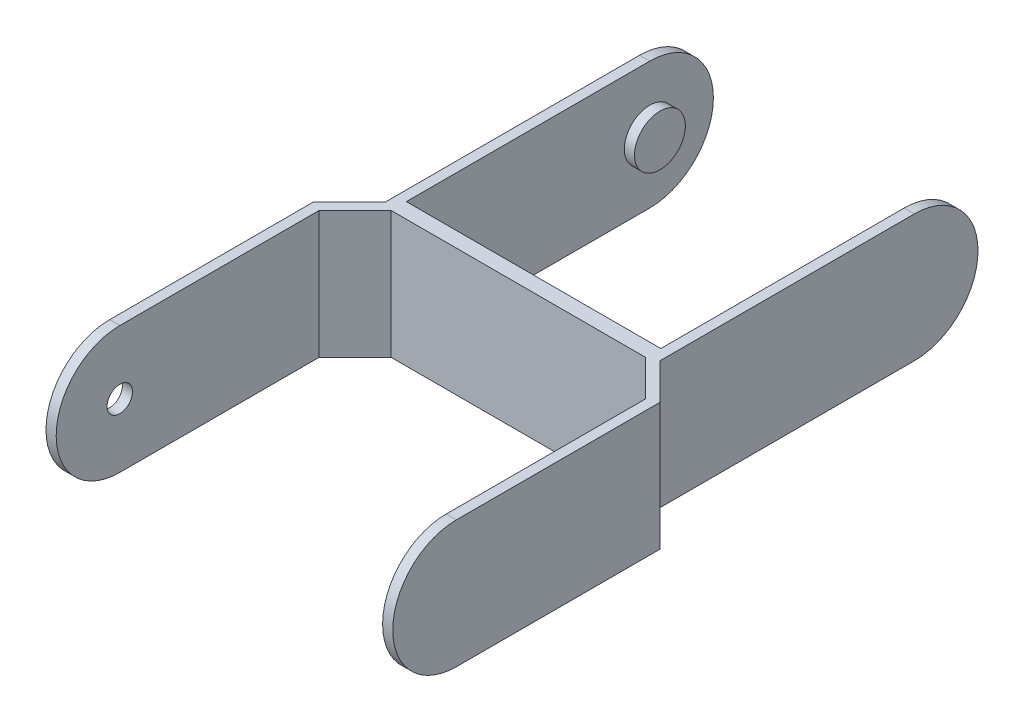
ISO-10303-21;
HEADER;
FILE_DESCRIPTION(('STEP AP214'),'2;1');
FILE_NAME('part.step','',(''),(''),'','','');
FILE_SCHEMA(('AUTOMOTIVE_DESIGN { 1 0 10303 214 1 1 1 1 }'));
ENDSEC;
DATA;
#1=APPLICATION_CONTEXT('core data for automotive mechanical design processes');
#2=APPLICATION_PROTOCOL_DEFINITION('international standard','automotive_design',2000,#1);
#3=PRODUCT_CONTEXT('',#1,'mechanical');
#4=PRODUCT('Part','Part','',(#3));
#5=PRODUCT_RELATED_PRODUCT_CATEGORY('part','',(#4));
#6=PRODUCT_DEFINITION_FORMATION('','',#4);
#7=PRODUCT_DEFINITION_CONTEXT('part definition',#1,'design');
#8=PRODUCT_DEFINITION('design','',#6,#7);
#9=PRODUCT_DEFINITION_SHAPE('','',#8);
#10=(LENGTH_UNIT() NAMED_UNIT(*) SI_UNIT(.MILLI.,.METRE.));
#11=(NAMED_UNIT(*) PLANE_ANGLE_UNIT() SI_UNIT($,.RADIAN.));
#12=(NAMED_UNIT(*) SI_UNIT($,.STERADIAN.) SOLID_ANGLE_UNIT());
#13=UNCERTAINTY_MEASURE_WITH_UNIT(LENGTH_MEASURE(1.E-05),#10,'distance_accuracy_value','');
#14=(GEOMETRIC_REPRESENTATION_CONTEXT(3) GLOBAL_UNCERTAINTY_ASSIGNED_CONTEXT((#13)) GLOBAL_UNIT_ASSIGNED_CONTEXT((#10,
#11,#12)) REPRESENTATION_CONTEXT('',''));
#15=CARTESIAN_POINT('',(0.,0.,0.));
#16=DIRECTION('',(0.,0.,1.));
#17=DIRECTION('',(1.,0.,0.));
#18=AXIS2_PLACEMENT_3D('',#15,#16,#17);
#19=CARTESIAN_POINT('',(-25.,25.,-37.9682734870824));
#20=DIRECTION('',(1.,0.,0.));
#21=DIRECTION('',(0.,0.,-1.));
#22=AXIS2_PLACEMENT_3D('',#19,#20,#21);
#23=PLANE('',#22);
#24=CARTESIAN_POINT('',(-25.,12.5,-37.9682734870824));
#25=DIRECTION('',(1.,0.,0.));
#26=DIRECTION('',(0.,0.,-1.));
#27=AXIS2_PLACEMENT_3D('',#24,#25,#26);
#28=CIRCLE('',#27,5.);
#29=CARTESIAN_POINT('',(-25.,12.5,-42.9682734870824));
#30=VERTEX_POINT('',#29);
#31=EDGE_CURVE('E282',#30,#30,#28,.T.);
#32=ORIENTED_EDGE('',*,*,#31,.F.);
#33=EDGE_LOOP('',(#32));
#34=FACE_BOUND('',#33,.T.);
#35=DIRECTION('',(0.,0.,1.));
#36=VECTOR('',#35,1.);
#37=CARTESIAN_POINT('',(-25.,0.,-37.9682734870824));
#38=LINE('',#37,#36);
#39=CARTESIAN_POINT('',(-25.,0.,-37.9682734870824));
#40=VERTEX_POINT('',#39);
#41=CARTESIAN_POINT('',(-25.,0.,9.86015363766381));
#42=VERTEX_POINT('',#41);
#43=EDGE_CURVE('E204',#40,#42,#38,.T.);
#44=ORIENTED_EDGE('',*,*,#43,.F.);
#45=CARTESIAN_POINT('',(-25.,12.5,-37.9682734870824));
#46=DIRECTION('',(-1.,0.,0.));
#47=DIRECTION('',(0.,0.,1.));
#48=AXIS2_PLACEMENT_3D('',#45,#46,#47);
#49=CIRCLE('',#48,12.5);
#50=CARTESIAN_POINT('',(-25.,25.,-37.9682734870824));
#51=VERTEX_POINT('',#50);
#52=EDGE_CURVE('E117',#51,#40,#49,.T.);
#53=ORIENTED_EDGE('',*,*,#52,.F.);
#54=DIRECTION('',(0.,0.,1.));
#55=VECTOR('',#54,1.);
#56=CARTESIAN_POINT('',(-25.,25.,-37.9682734870824));
#57=LINE('',#56,#55);
#58=CARTESIAN_POINT('',(-25.,25.,9.86015363766381));
#59=VERTEX_POINT('',#58);
#60=EDGE_CURVE('E250',#51,#59,#57,.T.);
#61=ORIENTED_EDGE('',*,*,#60,.T.);
#62=DIRECTION('',(0.,-1.,0.));
#63=VECTOR('',#62,1.);
#64=CARTESIAN_POINT('',(-25.,25.,9.86015363766381));
#65=LINE('',#64,#63);
#66=EDGE_CURVE('E125',#59,#42,#65,.T.);
#67=ORIENTED_EDGE('',*,*,#66,.T.);
#68=EDGE_LOOP('',(#44,#53,#61,#67));
#69=FACE_BOUND('',#68,.T.);
#70=ADVANCED_FACE('F47',(#34,#69),#23,.T.);
#71=CARTESIAN_POINT('',(-27.,25.,12.0317265129176));
#72=DIRECTION('',(-1.,0.,0.));
#73=DIRECTION('',(0.,0.,1.));
#74=AXIS2_PLACEMENT_3D('',#71,#72,#73);
#75=PLANE('',#74);
#76=DIRECTION('',(0.,0.,-1.));
#77=VECTOR('',#76,1.);
#78=CARTESIAN_POINT('',(-27.,0.,12.0317265129176));
#79=LINE('',#78,#77);
#80=CARTESIAN_POINT('',(-27.,0.,12.0317265129176));
#81=VERTEX_POINT('',#80);
#82=CARTESIAN_POINT('',(-27.,0.,-37.9682734870824));
#83=VERTEX_POINT('',#82);
#84=EDGE_CURVE('E244',#81,#83,#79,.T.);
#85=ORIENTED_EDGE('',*,*,#84,.F.);
#86=DIRECTION('',(0.,-1.,0.));
#87=VECTOR('',#86,1.);
#88=CARTESIAN_POINT('',(-27.,25.,12.0317265129176));
#89=LINE('',#88,#87);
#90=CARTESIAN_POINT('',(-27.,25.,12.0317265129176));
#91=VERTEX_POINT('',#90);
#92=EDGE_CURVE('E64',#91,#81,#89,.T.);
#93=ORIENTED_EDGE('',*,*,#92,.F.);
#94=DIRECTION('',(0.,0.,-1.));
#95=VECTOR('',#94,1.);
#96=CARTESIAN_POINT('',(-27.,25.,12.0317265129176));
#97=LINE('',#96,#95);
#98=CARTESIAN_POINT('',(-27.,25.,-37.9682734870824));
#99=VERTEX_POINT('',#98);
#100=EDGE_CURVE('E200',#91,#99,#97,.T.);
#101=ORIENTED_EDGE('',*,*,#100,.T.);
#102=CARTESIAN_POINT('',(-27.,12.5,-37.9682734870824));
#103=DIRECTION('',(-1.,0.,0.));
#104=DIRECTION('',(0.,0.,1.));
#105=AXIS2_PLACEMENT_3D('',#102,#103,#104);
#106=CIRCLE('',#105,12.5);
#107=EDGE_CURVE('E270',#99,#83,#106,.T.);
#108=ORIENTED_EDGE('',*,*,#107,.T.);
#109=EDGE_LOOP('',(#85,#93,#101,#108));
#110=FACE_BOUND('',#109,.T.);
#111=ADVANCED_FACE('F396',(#110),#75,.T.);
#112=CARTESIAN_POINT('',(-34.0710678118655,25.,19.1027943247831));
#113=DIRECTION('',(-0.707106781186547,0.,-0.707106781186548));
#114=DIRECTION('',(-0.707106781186548,0.,0.707106781186547));
#115=AXIS2_PLACEMENT_3D('',#112,#113,#114);
#116=PLANE('',#115);
#117=DIRECTION('',(0.707106781186548,0.,-0.707106781186547));
#118=VECTOR('',#117,1.);
#119=CARTESIAN_POINT('',(-34.0710678118655,0.,19.1027943247831));
#120=LINE('',#119,#118);
#121=CARTESIAN_POINT('',(-34.0710678118655,0.,19.1027943247831));
#122=VERTEX_POINT('',#121);
#123=EDGE_CURVE('E241',#122,#81,#120,.T.);
#124=ORIENTED_EDGE('',*,*,#123,.F.);
#125=DIRECTION('',(0.,-1.,0.));
#126=VECTOR('',#125,1.);
#127=CARTESIAN_POINT('',(-34.0710678118655,25.,19.1027943247831));
#128=LINE('',#127,#126);
#129=CARTESIAN_POINT('',(-34.0710678118655,25.,19.1027943247831));
#130=VERTEX_POINT('',#129);
#131=EDGE_CURVE('E174',#130,#122,#128,.T.);
#132=ORIENTED_EDGE('',*,*,#131,.F.);
#133=DIRECTION('',(0.707106781186548,0.,-0.707106781186547));
#134=VECTOR('',#133,1.);
#135=CARTESIAN_POINT('',(-34.0710678118655,25.,19.1027943247831));
#136=LINE('',#135,#134);
#137=EDGE_CURVE('E198',#130,#91,#136,.T.);
#138=ORIENTED_EDGE('',*,*,#137,.T.);
#139=ORIENTED_EDGE('',*,*,#92,.T.);
#140=EDGE_LOOP('',(#124,#132,#138,#139));
#141=FACE_BOUND('',#140,.T.);
#142=ADVANCED_FACE('F403',(#141),#116,.T.);
#143=CARTESIAN_POINT('',(-34.0710678118655,25.,59.1027943247831));
#144=DIRECTION('',(-1.,0.,0.));
#145=DIRECTION('',(0.,0.,1.));
#146=AXIS2_PLACEMENT_3D('',#143,#144,#145);
#147=PLANE('',#146);
#148=CARTESIAN_POINT('',(-34.0710678118655,12.5,59.1027943247831));
#149=DIRECTION('',(-1.,0.,0.));
#150=DIRECTION('',(0.,0.,1.));
#151=AXIS2_PLACEMENT_3D('',#148,#149,#150);
#152=CIRCLE('',#151,2.5);
#153=CARTESIAN_POINT('',(-34.0710678118655,12.5,61.6027943247831));
#154=VERTEX_POINT('',#153);
#155=EDGE_CURVE('E271',#154,#154,#152,.T.);
#156=ORIENTED_EDGE('',*,*,#155,.F.);
#157=EDGE_LOOP('',(#156));
#158=FACE_BOUND('',#157,.T.);
#159=DIRECTION('',(0.,0.,-1.));
#160=VECTOR('',#159,1.);
#161=CARTESIAN_POINT('',(-34.0710678118655,0.,59.1027943247831));
#162=LINE('',#161,#160);
#163=CARTESIAN_POINT('',(-34.0710678118655,0.,59.1027943247831));
#164=VERTEX_POINT('',#163);
#165=EDGE_CURVE('E238',#164,#122,#162,.T.);
#166=ORIENTED_EDGE('',*,*,#165,.F.);
#167=CARTESIAN_POINT('',(-34.0710678118655,12.5,59.1027943247831));
#168=DIRECTION('',(-1.,0.,0.));
#169=DIRECTION('',(0.,0.,1.));
#170=AXIS2_PLACEMENT_3D('',#167,#168,#169);
#171=CIRCLE('',#170,12.5);
#172=CARTESIAN_POINT('',(-34.0710678118655,25.,59.1027943247831));
#173=VERTEX_POINT('',#172);
#174=EDGE_CURVE('E286',#164,#173,#171,.T.);
#175=ORIENTED_EDGE('',*,*,#174,.T.);
#176=DIRECTION('',(0.,0.,-1.));
#177=VECTOR('',#176,1.);
#178=CARTESIAN_POINT('',(-34.0710678118655,25.,59.1027943247831));
#179=LINE('',#178,#177);
#180=EDGE_CURVE('E195',#173,#130,#179,.T.);
#181=ORIENTED_EDGE('',*,*,#180,.T.);
#182=ORIENTED_EDGE('',*,*,#131,.T.);
#183=EDGE_LOOP('',(#166,#175,#181,#182));
#184=FACE_BOUND('',#183,.T.);
#185=ADVANCED_FACE('F462',(#158,#184),#147,.T.);
#186=CARTESIAN_POINT('',(-32.0710678118655,25.,19.9312214495293));
#187=DIRECTION('',(1.,0.,0.));
#188=DIRECTION('',(0.,0.,-1.));
#189=AXIS2_PLACEMENT_3D('',#186,#187,#188);
#190=PLANE('',#189);
#191=CARTESIAN_POINT('',(-32.0710678118655,12.5,59.1027943247831));
#192=DIRECTION('',(1.,0.,0.));
#193=DIRECTION('',(0.,0.,-1.));
#194=AXIS2_PLACEMENT_3D('',#191,#192,#193);
#195=CIRCLE('',#194,2.5);
#196=CARTESIAN_POINT('',(-32.0710678118655,12.5,56.6027943247831));
#197=VERTEX_POINT('',#196);
#198=EDGE_CURVE('E268',#197,#197,#195,.T.);
#199=ORIENTED_EDGE('',*,*,#198,.F.);
#200=EDGE_LOOP('',(#199));
#201=FACE_BOUND('',#200,.T.);
#202=DIRECTION('',(0.,0.,1.));
#203=VECTOR('',#202,1.);
#204=CARTESIAN_POINT('',(-32.0710678118655,0.,19.9312214495293));
#205=LINE('',#204,#203);
#206=CARTESIAN_POINT('',(-32.0710678118655,0.,19.9312214495293));
#207=VERTEX_POINT('',#206);
#208=CARTESIAN_POINT('',(-32.0710678118655,0.,59.1027943247831));
#209=VERTEX_POINT('',#208);
#210=EDGE_CURVE('E169',#207,#209,#205,.T.);
#211=ORIENTED_EDGE('',*,*,#210,.F.);
#212=DIRECTION('',(0.,-1.,0.));
#213=VECTOR('',#212,1.);
#214=CARTESIAN_POINT('',(-32.0710678118655,25.,19.9312214495293));
#215=LINE('',#214,#213);
#216=CARTESIAN_POINT('',(-32.0710678118655,25.,19.9312214495293));
#217=VERTEX_POINT('',#216);
#218=EDGE_CURVE('E162',#217,#207,#215,.T.);
#219=ORIENTED_EDGE('',*,*,#218,.F.);
#220=DIRECTION('',(0.,0.,1.));
#221=VECTOR('',#220,1.);
#222=CARTESIAN_POINT('',(-32.0710678118655,25.,19.9312214495293));
#223=LINE('',#222,#221);
#224=CARTESIAN_POINT('',(-32.0710678118655,25.,59.1027943247831));
#225=VERTEX_POINT('',#224);
#226=EDGE_CURVE('E167',#217,#225,#223,.T.);
#227=ORIENTED_EDGE('',*,*,#226,.T.);
#228=CARTESIAN_POINT('',(-32.0710678118655,12.5,59.1027943247831));
#229=DIRECTION('',(-1.,0.,0.));
#230=DIRECTION('',(0.,0.,1.));
#231=AXIS2_PLACEMENT_3D('',#228,#229,#230);
#232=CIRCLE('',#231,12.5);
#233=EDGE_CURVE('E288',#209,#225,#232,.T.);
#234=ORIENTED_EDGE('',*,*,#233,.F.);
#235=EDGE_LOOP('',(#211,#219,#227,#234));
#236=FACE_BOUND('',#235,.T.);
#237=ADVANCED_FACE('F164',(#201,#236),#190,.T.);
#238=CARTESIAN_POINT('',(-25.,25.,12.8601536376638));
#239=DIRECTION('',(0.707106781186547,0.,0.707106781186548));
#240=DIRECTION('',(0.707106781186548,0.,-0.707106781186547));
#241=AXIS2_PLACEMENT_3D('',#238,#239,#240);
#242=PLANE('',#241);
#243=DIRECTION('',(-0.707106781186548,0.,0.707106781186547));
#244=VECTOR('',#243,1.);
#245=CARTESIAN_POINT('',(-25.,0.,12.8601536376638));
#246=LINE('',#245,#244);
#247=CARTESIAN_POINT('',(-25.,0.,12.8601536376638));
#248=VERTEX_POINT('',#247);
#249=EDGE_CURVE('E232',#248,#207,#246,.T.);
#250=ORIENTED_EDGE('',*,*,#249,.F.);
#251=DIRECTION('',(0.,-1.,0.));
#252=VECTOR('',#251,1.);
#253=CARTESIAN_POINT('',(-25.,25.,12.8601536376638));
#254=LINE('',#253,#252);
#255=CARTESIAN_POINT('',(-25.,25.,12.8601536376638));
#256=VERTEX_POINT('',#255);
#257=EDGE_CURVE('E175',#256,#248,#254,.T.);
#258=ORIENTED_EDGE('',*,*,#257,.F.);
#259=DIRECTION('',(-0.707106781186548,0.,0.707106781186547));
#260=VECTOR('',#259,1.);
#261=CARTESIAN_POINT('',(-25.,25.,12.8601536376638));
#262=LINE('',#261,#260);
#263=EDGE_CURVE('E181',#256,#217,#262,.T.);
#264=ORIENTED_EDGE('',*,*,#263,.T.);
#265=ORIENTED_EDGE('',*,*,#218,.T.);
#266=EDGE_LOOP('',(#250,#258,#264,#265));
#267=FACE_BOUND('',#266,.T.);
#268=ADVANCED_FACE('F186',(#267),#242,.T.);
#269=CARTESIAN_POINT('',(-25.,25.,12.8601536376638));
#270=DIRECTION('',(0.,0.,-1.));
#271=DIRECTION('',(-1.,0.,0.));
#272=AXIS2_PLACEMENT_3D('',#269,#270,#271);
#273=PLANE('',#272);
#274=DIRECTION('',(1.,0.,0.));
#275=VECTOR('',#274,1.);
#276=CARTESIAN_POINT('',(-25.,0.,12.8601536376638));
#277=LINE('',#276,#275);
#278=CARTESIAN_POINT('',(25.,0.,12.8601536376638));
#279=VERTEX_POINT('',#278);
#280=EDGE_CURVE('E230',#248,#279,#277,.T.);
#281=ORIENTED_EDGE('',*,*,#280,.T.);
#282=DIRECTION('',(0.,-1.,0.));
#283=VECTOR('',#282,1.);
#284=CARTESIAN_POINT('',(25.,25.,12.8601536376638));
#285=LINE('',#284,#283);
#286=CARTESIAN_POINT('',(25.,25.,12.8601536376638));
#287=VERTEX_POINT('',#286);
#288=EDGE_CURVE('E254',#287,#279,#285,.T.);
#289=ORIENTED_EDGE('',*,*,#288,.F.);
#290=DIRECTION('',(1.,0.,0.));
#291=VECTOR('',#290,1.);
#292=CARTESIAN_POINT('',(-25.,25.,12.8601536376638));
#293=LINE('',#292,#291);
#294=EDGE_CURVE('E188',#256,#287,#293,.T.);
#295=ORIENTED_EDGE('',*,*,#294,.F.);
#296=ORIENTED_EDGE('',*,*,#257,.T.);
#297=EDGE_LOOP('',(#281,#289,#295,#296));
#298=FACE_BOUND('',#297,.T.);
#299=ADVANCED_FACE('F386',(#298),#273,.F.);
#300=CARTESIAN_POINT('',(25.,25.,12.8601536376638));
#301=DIRECTION('',(0.707106781186547,0.,-0.707106781186548));
#302=DIRECTION('',(-0.707106781186548,0.,-0.707106781186547));
#303=AXIS2_PLACEMENT_3D('',#300,#301,#302);
#304=PLANE('',#303);
#305=DIRECTION('',(0.707106781186548,0.,0.707106781186547));
#306=VECTOR('',#305,1.);
#307=CARTESIAN_POINT('',(25.,0.,12.8601536376638));
#308=LINE('',#307,#306);
#309=CARTESIAN_POINT('',(32.0710678118655,0.,19.9312214495292));
#310=VERTEX_POINT('',#309);
#311=EDGE_CURVE('E228',#279,#310,#308,.T.);
#312=ORIENTED_EDGE('',*,*,#311,.T.);
#313=DIRECTION('',(0.,-1.,0.));
#314=VECTOR('',#313,1.);
#315=CARTESIAN_POINT('',(32.0710678118655,25.,19.9312214495292));
#316=LINE('',#315,#314);
#317=CARTESIAN_POINT('',(32.0710678118655,25.,19.9312214495292));
#318=VERTEX_POINT('',#317);
#319=EDGE_CURVE('E257',#318,#310,#316,.T.);
#320=ORIENTED_EDGE('',*,*,#319,.F.);
#321=DIRECTION('',(0.707106781186548,0.,0.707106781186547));
#322=VECTOR('',#321,1.);
#323=CARTESIAN_POINT('',(25.,25.,12.8601536376638));
#324=LINE('',#323,#322);
#325=EDGE_CURVE('E190',#287,#318,#324,.T.);
#326=ORIENTED_EDGE('',*,*,#325,.F.);
#327=ORIENTED_EDGE('',*,*,#288,.T.);
#328=EDGE_LOOP('',(#312,#320,#326,#327));
#329=FACE_BOUND('',#328,.T.);
#330=ADVANCED_FACE('F326',(#329),#304,.F.);
#331=CARTESIAN_POINT('',(32.0710678118655,25.,19.9312214495292));
#332=DIRECTION('',(1.,0.,0.));
#333=DIRECTION('',(0.,0.,-1.));
#334=AXIS2_PLACEMENT_3D('',#331,#332,#333);
#335=PLANE('',#334);
#336=DIRECTION('',(0.,0.,1.));
#337=VECTOR('',#336,1.);
#338=CARTESIAN_POINT('',(32.0710678118655,0.,19.9312214495292));
#339=LINE('',#338,#337);
#340=CARTESIAN_POINT('',(32.0710678118655,0.,59.102794324783));
#341=VERTEX_POINT('',#340);
#342=EDGE_CURVE('E226',#310,#341,#339,.T.);
#343=ORIENTED_EDGE('',*,*,#342,.T.);
#344=CARTESIAN_POINT('',(32.0710678118655,12.5,59.102794324783));
#345=DIRECTION('',(-1.,0.,0.));
#346=DIRECTION('',(0.,0.,1.));
#347=AXIS2_PLACEMENT_3D('',#344,#345,#346);
#348=CIRCLE('',#347,12.5);
#349=CARTESIAN_POINT('',(32.0710678118655,25.,59.102794324783));
#350=VERTEX_POINT('',#349);
#351=EDGE_CURVE('E208',#341,#350,#348,.T.);
#352=ORIENTED_EDGE('',*,*,#351,.T.);
#353=DIRECTION('',(0.,0.,1.));
#354=VECTOR('',#353,1.);
#355=CARTESIAN_POINT('',(32.0710678118655,25.,19.9312214495292));
#356=LINE('',#355,#354);
#357=EDGE_CURVE('E320',#318,#350,#356,.T.);
#358=ORIENTED_EDGE('',*,*,#357,.F.);
#359=ORIENTED_EDGE('',*,*,#319,.T.);
#360=EDGE_LOOP('',(#343,#352,#358,#359));
#361=FACE_BOUND('',#360,.T.);
#362=ADVANCED_FACE('F330',(#361),#335,.F.);
#363=CARTESIAN_POINT('',(34.0710678118655,25.,59.102794324783));
#364=DIRECTION('',(-1.,0.,0.));
#365=DIRECTION('',(0.,0.,1.));
#366=AXIS2_PLACEMENT_3D('',#363,#364,#365);
#367=PLANE('',#366);
#368=DIRECTION('',(0.,0.,-1.));
#369=VECTOR('',#368,1.);
#370=CARTESIAN_POINT('',(34.0710678118655,0.,59.102794324783));
#371=LINE('',#370,#369);
#372=CARTESIAN_POINT('',(34.0710678118655,0.,59.102794324783));
#373=VERTEX_POINT('',#372);
#374=CARTESIAN_POINT('',(34.0710678118655,0.,19.102794324783));
#375=VERTEX_POINT('',#374);
#376=EDGE_CURVE('E221',#373,#375,#371,.T.);
#377=ORIENTED_EDGE('',*,*,#376,.T.);
#378=DIRECTION('',(0.,-1.,0.));
#379=VECTOR('',#378,1.);
#380=CARTESIAN_POINT('',(34.0710678118655,25.,19.102794324783));
#381=LINE('',#380,#379);
#382=CARTESIAN_POINT('',(34.0710678118655,25.,19.102794324783));
#383=VERTEX_POINT('',#382);
#384=EDGE_CURVE('E260',#383,#375,#381,.T.);
#385=ORIENTED_EDGE('',*,*,#384,.F.);
#386=DIRECTION('',(0.,0.,-1.));
#387=VECTOR('',#386,1.);
#388=CARTESIAN_POINT('',(34.0710678118655,25.,59.102794324783));
#389=LINE('',#388,#387);
#390=CARTESIAN_POINT('',(34.0710678118655,25.,59.102794324783));
#391=VERTEX_POINT('',#390);
#392=EDGE_CURVE('E316',#391,#383,#389,.T.);
#393=ORIENTED_EDGE('',*,*,#392,.F.);
#394=CARTESIAN_POINT('',(34.0710678118655,12.5,59.102794324783));
#395=DIRECTION('',(-1.,0.,0.));
#396=DIRECTION('',(0.,0.,1.));
#397=AXIS2_PLACEMENT_3D('',#394,#395,#396);
#398=CIRCLE('',#397,12.5);
#399=EDGE_CURVE('E297',#373,#391,#398,.T.);
#400=ORIENTED_EDGE('',*,*,#399,.F.);
#401=EDGE_LOOP('',(#377,#385,#393,#400));
#402=FACE_BOUND('',#401,.T.);
#403=ADVANCED_FACE('F340',(#402),#367,.F.);
#404=CARTESIAN_POINT('',(34.0710678118655,25.,19.102794324783));
#405=DIRECTION('',(-0.707106781186547,0.,0.707106781186548));
#406=DIRECTION('',(0.707106781186548,0.,0.707106781186547));
#407=AXIS2_PLACEMENT_3D('',#404,#405,#406);
#408=PLANE('',#407);
#409=DIRECTION('',(-0.707106781186548,0.,-0.707106781186547));
#410=VECTOR('',#409,1.);
#411=CARTESIAN_POINT('',(34.0710678118655,0.,19.102794324783));
#412=LINE('',#411,#410);
#413=CARTESIAN_POINT('',(27.,0.,12.0317265129176));
#414=VERTEX_POINT('',#413);
#415=EDGE_CURVE('E219',#375,#414,#412,.T.);
#416=ORIENTED_EDGE('',*,*,#415,.T.);
#417=DIRECTION('',(0.,-1.,0.));
#418=VECTOR('',#417,1.);
#419=CARTESIAN_POINT('',(27.,25.,12.0317265129176));
#420=LINE('',#419,#418);
#421=CARTESIAN_POINT('',(27.,25.,12.0317265129176));
#422=VERTEX_POINT('',#421);
#423=EDGE_CURVE('E263',#422,#414,#420,.T.);
#424=ORIENTED_EDGE('',*,*,#423,.F.);
#425=DIRECTION('',(-0.707106781186548,0.,-0.707106781186547));
#426=VECTOR('',#425,1.);
#427=CARTESIAN_POINT('',(34.0710678118655,25.,19.102794324783));
#428=LINE('',#427,#426);
#429=EDGE_CURVE('E314',#383,#422,#428,.T.);
#430=ORIENTED_EDGE('',*,*,#429,.F.);
#431=ORIENTED_EDGE('',*,*,#384,.T.);
#432=EDGE_LOOP('',(#416,#424,#430,#431));
#433=FACE_BOUND('',#432,.T.);
#434=ADVANCED_FACE('F346',(#433),#408,.F.);
#435=CARTESIAN_POINT('',(27.,25.,12.0317265129176));
#436=DIRECTION('',(-1.,0.,0.));
#437=DIRECTION('',(0.,0.,1.));
#438=AXIS2_PLACEMENT_3D('',#435,#436,#437);
#439=PLANE('',#438);
#440=DIRECTION('',(0.,0.,-1.));
#441=VECTOR('',#440,1.);
#442=CARTESIAN_POINT('',(27.,0.,12.0317265129176));
#443=LINE('',#442,#441);
#444=CARTESIAN_POINT('',(27.,0.,-37.9682734870824));
#445=VERTEX_POINT('',#444);
#446=EDGE_CURVE('E217',#414,#445,#443,.T.);
#447=ORIENTED_EDGE('',*,*,#446,.T.);
#448=CARTESIAN_POINT('',(27.,12.5,-37.9682734870824));
#449=DIRECTION('',(1.,0.,0.));
#450=DIRECTION('',(0.,0.,-1.));
#451=AXIS2_PLACEMENT_3D('',#448,#449,#450);
#452=CIRCLE('',#451,12.5);
#453=CARTESIAN_POINT('',(27.,25.,-37.9682734870824));
#454=VERTEX_POINT('',#453);
#455=EDGE_CURVE('E291',#445,#454,#452,.T.);
#456=ORIENTED_EDGE('',*,*,#455,.T.);
#457=DIRECTION('',(0.,0.,-1.));
#458=VECTOR('',#457,1.);
#459=CARTESIAN_POINT('',(27.,25.,12.0317265129176));
#460=LINE('',#459,#458);
#461=EDGE_CURVE('E312',#422,#454,#460,.T.);
#462=ORIENTED_EDGE('',*,*,#461,.F.);
#463=ORIENTED_EDGE('',*,*,#423,.T.);
#464=EDGE_LOOP('',(#447,#456,#462,#463));
#465=FACE_BOUND('',#464,.T.);
#466=ADVANCED_FACE('F355',(#465),#439,.F.);
#467=CARTESIAN_POINT('',(25.,25.,-37.9682734870824));
#468=DIRECTION('',(1.,0.,0.));
#469=DIRECTION('',(0.,0.,-1.));
#470=AXIS2_PLACEMENT_3D('',#467,#468,#469);
#471=PLANE('',#470);
#472=CARTESIAN_POINT('',(25.,13.1509476346281,-39.4335055177066));
#473=DIRECTION('',(1.,0.,0.));
#474=DIRECTION('',(0.,0.,-1.));
#475=AXIS2_PLACEMENT_3D('',#472,#473,#474);
#476=CIRCLE('',#475,5.);
#477=CARTESIAN_POINT('',(25.,13.1509476346281,-44.4335055177066));
#478=VERTEX_POINT('',#477);
#479=EDGE_CURVE('E50',#478,#478,#476,.F.);
#480=ORIENTED_EDGE('',*,*,#479,.F.);
#481=EDGE_LOOP('',(#480));
#482=FACE_BOUND('',#481,.T.);
#483=DIRECTION('',(0.,0.,1.));
#484=VECTOR('',#483,1.);
#485=CARTESIAN_POINT('',(25.,0.,-37.9682734870824));
#486=LINE('',#485,#484);
#487=CARTESIAN_POINT('',(25.,0.,-37.9682734870824));
#488=VERTEX_POINT('',#487);
#489=CARTESIAN_POINT('',(25.,0.,9.86015363766375));
#490=VERTEX_POINT('',#489);
#491=EDGE_CURVE('E211',#488,#490,#486,.T.);
#492=ORIENTED_EDGE('',*,*,#491,.T.);
#493=DIRECTION('',(0.,-1.,0.));
#494=VECTOR('',#493,1.);
#495=CARTESIAN_POINT('',(25.,25.,9.86015363766375));
#496=LINE('',#495,#494);
#497=CARTESIAN_POINT('',(25.,25.,9.86015363766375));
#498=VERTEX_POINT('',#497);
#499=EDGE_CURVE('E266',#498,#490,#496,.T.);
#500=ORIENTED_EDGE('',*,*,#499,.F.);
#501=DIRECTION('',(0.,0.,1.));
#502=VECTOR('',#501,1.);
#503=CARTESIAN_POINT('',(25.,25.,-37.9682734870824));
#504=LINE('',#503,#502);
#505=CARTESIAN_POINT('',(25.,25.,-37.9682734870824));
#506=VERTEX_POINT('',#505);
#507=EDGE_CURVE('E308',#506,#498,#504,.T.);
#508=ORIENTED_EDGE('',*,*,#507,.F.);
#509=CARTESIAN_POINT('',(25.,12.5,-37.9682734870824));
#510=DIRECTION('',(1.,0.,0.));
#511=DIRECTION('',(0.,0.,-1.));
#512=AXIS2_PLACEMENT_3D('',#509,#510,#511);
#513=CIRCLE('',#512,12.5);
#514=EDGE_CURVE('E294',#488,#506,#513,.T.);
#515=ORIENTED_EDGE('',*,*,#514,.F.);
#516=EDGE_LOOP('',(#492,#500,#508,#515));
#517=FACE_BOUND('',#516,.T.);
#518=ADVANCED_FACE('F364',(#482,#517),#471,.F.);
#519=CARTESIAN_POINT('',(-25.,25.,9.86015363766381));
#520=DIRECTION('',(0.,0.,-1.));
#521=DIRECTION('',(-1.,0.,0.));
#522=AXIS2_PLACEMENT_3D('',#519,#520,#521);
#523=PLANE('',#522);
#524=DIRECTION('',(1.,0.,0.));
#525=VECTOR('',#524,1.);
#526=CARTESIAN_POINT('',(-25.,0.,9.86015363766381));
#527=LINE('',#526,#525);
#528=EDGE_CURVE('E207',#42,#490,#527,.T.);
#529=ORIENTED_EDGE('',*,*,#528,.F.);
#530=ORIENTED_EDGE('',*,*,#66,.F.);
#531=DIRECTION('',(1.,0.,0.));
#532=VECTOR('',#531,1.);
#533=CARTESIAN_POINT('',(-25.,25.,9.86015363766381));
#534=LINE('',#533,#532);
#535=EDGE_CURVE('E306',#59,#498,#534,.T.);
#536=ORIENTED_EDGE('',*,*,#535,.T.);
#537=ORIENTED_EDGE('',*,*,#499,.T.);
#538=EDGE_LOOP('',(#529,#530,#536,#537));
#539=FACE_BOUND('',#538,.T.);
#540=ADVANCED_FACE('F457',(#539),#523,.T.);
#541=CARTESIAN_POINT('',(0.,25.,0.));
#542=DIRECTION('',(0.,1.,0.));
#543=DIRECTION('',(0.,0.,1.));
#544=AXIS2_PLACEMENT_3D('',#541,#542,#543);
#545=PLANE('',#544);
#546=ORIENTED_EDGE('',*,*,#392,.T.);
#547=ORIENTED_EDGE('',*,*,#429,.T.);
#548=ORIENTED_EDGE('',*,*,#461,.T.);
#549=DIRECTION('',(-1.,0.,0.));
#550=VECTOR('',#549,1.);
#551=CARTESIAN_POINT('',(27.,25.,-37.9682734870824));
#552=LINE('',#551,#550);
#553=EDGE_CURVE('E310',#454,#506,#552,.T.);
#554=ORIENTED_EDGE('',*,*,#553,.T.);
#555=ORIENTED_EDGE('',*,*,#507,.T.);
#556=ORIENTED_EDGE('',*,*,#535,.F.);
#557=ORIENTED_EDGE('',*,*,#60,.F.);
#558=DIRECTION('',(1.,0.,0.));
#559=VECTOR('',#558,1.);
#560=CARTESIAN_POINT('',(-27.,25.,-37.9682734870824));
#561=LINE('',#560,#559);
#562=EDGE_CURVE('E202',#99,#51,#561,.T.);
#563=ORIENTED_EDGE('',*,*,#562,.F.);
#564=ORIENTED_EDGE('',*,*,#100,.F.);
#565=ORIENTED_EDGE('',*,*,#137,.F.);
#566=ORIENTED_EDGE('',*,*,#180,.F.);
#567=DIRECTION('',(-1.,0.,0.));
#568=VECTOR('',#567,1.);
#569=CARTESIAN_POINT('',(-32.0710678118655,25.,59.1027943247831));
#570=LINE('',#569,#568);
#571=EDGE_CURVE('E184',#225,#173,#570,.T.);
#572=ORIENTED_EDGE('',*,*,#571,.F.);
#573=ORIENTED_EDGE('',*,*,#226,.F.);
#574=ORIENTED_EDGE('',*,*,#263,.F.);
#575=ORIENTED_EDGE('',*,*,#294,.T.);
#576=ORIENTED_EDGE('',*,*,#325,.T.);
#577=ORIENTED_EDGE('',*,*,#357,.T.);
#578=DIRECTION('',(1.,0.,0.));
#579=VECTOR('',#578,1.);
#580=CARTESIAN_POINT('',(32.0710678118655,25.,59.102794324783));
#581=LINE('',#580,#579);
#582=EDGE_CURVE('E318',#350,#391,#581,.T.);
#583=ORIENTED_EDGE('',*,*,#582,.T.);
#584=EDGE_LOOP('',(#546,#547,#548,#554,#555,#556,#557,#563,#564,#565,#566,#572,#573,#574,#575,
#576,#577,#583));
#585=FACE_BOUND('',#584,.T.);
#586=ADVANCED_FACE('F180',(#585),#545,.T.);
#587=CARTESIAN_POINT('',(0.,0.,0.));
#588=DIRECTION('',(0.,1.,0.));
#589=DIRECTION('',(0.,0.,1.));
#590=AXIS2_PLACEMENT_3D('',#587,#588,#589);
#591=PLANE('',#590);
#592=ORIENTED_EDGE('',*,*,#415,.F.);
#593=ORIENTED_EDGE('',*,*,#376,.F.);
#594=DIRECTION('',(1.,0.,0.));
#595=VECTOR('',#594,1.);
#596=CARTESIAN_POINT('',(32.0710678118655,0.,59.102794324783));
#597=LINE('',#596,#595);
#598=EDGE_CURVE('E223',#341,#373,#597,.T.);
#599=ORIENTED_EDGE('',*,*,#598,.F.);
#600=ORIENTED_EDGE('',*,*,#342,.F.);
#601=ORIENTED_EDGE('',*,*,#311,.F.);
#602=ORIENTED_EDGE('',*,*,#280,.F.);
#603=ORIENTED_EDGE('',*,*,#249,.T.);
#604=ORIENTED_EDGE('',*,*,#210,.T.);
#605=DIRECTION('',(-1.,0.,0.));
#606=VECTOR('',#605,1.);
#607=CARTESIAN_POINT('',(-32.0710678118655,0.,59.1027943247831));
#608=LINE('',#607,#606);
#609=EDGE_CURVE('E235',#209,#164,#608,.T.);
#610=ORIENTED_EDGE('',*,*,#609,.T.);
#611=ORIENTED_EDGE('',*,*,#165,.T.);
#612=ORIENTED_EDGE('',*,*,#123,.T.);
#613=ORIENTED_EDGE('',*,*,#84,.T.);
#614=DIRECTION('',(1.,0.,0.));
#615=VECTOR('',#614,1.);
#616=CARTESIAN_POINT('',(-27.,0.,-37.9682734870824));
#617=LINE('',#616,#615);
#618=EDGE_CURVE('E247',#83,#40,#617,.T.);
#619=ORIENTED_EDGE('',*,*,#618,.T.);
#620=ORIENTED_EDGE('',*,*,#43,.T.);
#621=ORIENTED_EDGE('',*,*,#528,.T.);
#622=ORIENTED_EDGE('',*,*,#491,.F.);
#623=DIRECTION('',(-1.,0.,0.));
#624=VECTOR('',#623,1.);
#625=CARTESIAN_POINT('',(27.,0.,-37.9682734870824));
#626=LINE('',#625,#624);
#627=EDGE_CURVE('E214',#445,#488,#626,.T.);
#628=ORIENTED_EDGE('',*,*,#627,.F.);
#629=ORIENTED_EDGE('',*,*,#446,.F.);
#630=EDGE_LOOP('',(#592,#593,#599,#600,#601,#602,#603,#604,#610,#611,#612,#613,#619,#620,#621,
#622,#628,#629));
#631=FACE_BOUND('',#630,.T.);
#632=ADVANCED_FACE('F360',(#631),#591,.F.);
#633=CARTESIAN_POINT('',(32.0710678118655,12.5,59.102794324783));
#634=DIRECTION('',(1.,0.,0.));
#635=DIRECTION('',(0.,0.,-1.));
#636=AXIS2_PLACEMENT_3D('',#633,#634,#635);
#637=CYLINDRICAL_SURFACE('',#636,12.5);
#638=ORIENTED_EDGE('',*,*,#399,.T.);
#639=ORIENTED_EDGE('',*,*,#582,.F.);
#640=ORIENTED_EDGE('',*,*,#351,.F.);
#641=ORIENTED_EDGE('',*,*,#598,.T.);
#642=EDGE_LOOP('',(#638,#639,#640,#641));
#643=FACE_BOUND('',#642,.T.);
#644=ADVANCED_FACE('F335',(#643),#637,.T.);
#645=CARTESIAN_POINT('',(25.,12.5,-37.9682734870824));
#646=DIRECTION('',(1.,0.,0.));
#647=DIRECTION('',(0.,0.,-1.));
#648=AXIS2_PLACEMENT_3D('',#645,#646,#647);
#649=CYLINDRICAL_SURFACE('',#648,12.5);
#650=ORIENTED_EDGE('',*,*,#455,.F.);
#651=ORIENTED_EDGE('',*,*,#627,.T.);
#652=ORIENTED_EDGE('',*,*,#514,.T.);
#653=ORIENTED_EDGE('',*,*,#553,.F.);
#654=EDGE_LOOP('',(#650,#651,#652,#653));
#655=FACE_BOUND('',#654,.T.);
#656=ADVANCED_FACE('F353',(#655),#649,.T.);
#657=CARTESIAN_POINT('',(-32.0710678118655,12.5,59.1027943247831));
#658=DIRECTION('',(-1.,0.,0.));
#659=DIRECTION('',(0.,0.,1.));
#660=AXIS2_PLACEMENT_3D('',#657,#658,#659);
#661=CYLINDRICAL_SURFACE('',#660,12.5);
#662=ORIENTED_EDGE('',*,*,#174,.F.);
#663=ORIENTED_EDGE('',*,*,#609,.F.);
#664=ORIENTED_EDGE('',*,*,#233,.T.);
#665=ORIENTED_EDGE('',*,*,#571,.T.);
#666=EDGE_LOOP('',(#662,#663,#664,#665));
#667=FACE_BOUND('',#666,.T.);
#668=ADVANCED_FACE('F382',(#667),#661,.T.);
#669=CARTESIAN_POINT('',(-25.,12.5,-37.9682734870824));
#670=DIRECTION('',(-1.,0.,0.));
#671=DIRECTION('',(0.,0.,1.));
#672=AXIS2_PLACEMENT_3D('',#669,#670,#671);
#673=CYLINDRICAL_SURFACE('',#672,12.5);
#674=ORIENTED_EDGE('',*,*,#107,.F.);
#675=ORIENTED_EDGE('',*,*,#562,.T.);
#676=ORIENTED_EDGE('',*,*,#52,.T.);
#677=ORIENTED_EDGE('',*,*,#618,.F.);
#678=EDGE_LOOP('',(#674,#675,#676,#677));
#679=FACE_BOUND('',#678,.T.);
#680=ADVANCED_FACE('F446',(#679),#673,.T.);
#681=CARTESIAN_POINT('',(-24.0710678118655,12.5,59.1027943247831));
#682=DIRECTION('',(-1.,0.,0.));
#683=DIRECTION('',(0.,0.,1.));
#684=AXIS2_PLACEMENT_3D('',#681,#682,#683);
#685=CYLINDRICAL_SURFACE('',#684,2.5);
#686=ORIENTED_EDGE('',*,*,#198,.T.);
#687=EDGE_LOOP('',(#686));
#688=FACE_BOUND('',#687,.T.);
#689=ORIENTED_EDGE('',*,*,#155,.T.);
#690=EDGE_LOOP('',(#689));
#691=FACE_BOUND('',#690,.T.);
#692=ADVANCED_FACE('F443',(#688,#691),#685,.F.);
#693=CARTESIAN_POINT('',(-23.,12.5,-37.9682734870824));
#694=DIRECTION('',(-1.,0.,0.));
#695=DIRECTION('',(0.,0.,1.));
#696=AXIS2_PLACEMENT_3D('',#693,#694,#695);
#697=CYLINDRICAL_SURFACE('',#696,5.);
#698=CARTESIAN_POINT('',(-23.,12.5,-37.9682734870824));
#699=DIRECTION('',(1.,0.,0.));
#700=DIRECTION('',(0.,0.,-1.));
#701=AXIS2_PLACEMENT_3D('',#698,#699,#700);
#702=CIRCLE('',#701,5.);
#703=CARTESIAN_POINT('',(-23.,12.5,-42.9682734870824));
#704=VERTEX_POINT('',#703);
#705=EDGE_CURVE('E277',#704,#704,#702,.T.);
#706=ORIENTED_EDGE('',*,*,#705,.F.);
#707=EDGE_LOOP('',(#706));
#708=FACE_BOUND('',#707,.T.);
#709=ORIENTED_EDGE('',*,*,#31,.T.);
#710=EDGE_LOOP('',(#709));
#711=FACE_BOUND('',#710,.T.);
#712=ADVANCED_FACE('F440',(#708,#711),#697,.T.);
#713=CARTESIAN_POINT('',(-23.,12.5,-37.9682734870824));
#714=DIRECTION('',(1.,0.,0.));
#715=DIRECTION('',(0.,0.,-1.));
#716=AXIS2_PLACEMENT_3D('',#713,#714,#715);
#717=PLANE('',#716);
#718=ORIENTED_EDGE('',*,*,#705,.T.);
#719=EDGE_LOOP('',(#718));
#720=FACE_BOUND('',#719,.T.);
#721=ADVANCED_FACE('F433',(#720),#717,.T.);
#722=CARTESIAN_POINT('',(23.,13.1509476346281,-39.4335055177066));
#723=DIRECTION('',(1.,0.,0.));
#724=DIRECTION('',(0.,0.,-1.));
#725=AXIS2_PLACEMENT_3D('',#722,#723,#724);
#726=CYLINDRICAL_SURFACE('',#725,5.);
#727=CARTESIAN_POINT('',(23.,13.1509476346281,-39.4335055177066));
#728=DIRECTION('',(-1.,0.,0.));
#729=DIRECTION('',(0.,0.,1.));
#730=AXIS2_PLACEMENT_3D('',#727,#728,#729);
#731=CIRCLE('',#730,5.);
#732=CARTESIAN_POINT('',(23.,13.1509476346281,-34.4335055177066));
#733=VERTEX_POINT('',#732);
#734=EDGE_CURVE('E408',#733,#733,#731,.T.);
#735=ORIENTED_EDGE('',*,*,#734,.F.);
#736=EDGE_LOOP('',(#735));
#737=FACE_BOUND('',#736,.T.);
#738=ORIENTED_EDGE('',*,*,#479,.T.);
#739=EDGE_LOOP('',(#738));
#740=FACE_BOUND('',#739,.T.);
#741=ADVANCED_FACE('F428',(#737,#740),#726,.T.);
#742=CARTESIAN_POINT('',(23.,13.1509476346281,-39.4335055177066));
#743=DIRECTION('',(-1.,0.,0.));
#744=DIRECTION('',(0.,0.,1.));
#745=AXIS2_PLACEMENT_3D('',#742,#743,#744);
#746=PLANE('',#745);
#747=CARTESIAN_POINT('',(23.,13.1509476346281,-39.4335055177066));
#748=DIRECTION('',(-1.,0.,0.));
#749=DIRECTION('',(0.,0.,1.));
#750=AXIS2_PLACEMENT_3D('',#747,#748,#749);
#751=CIRCLE('',#750,2.5);
#752=CARTESIAN_POINT('',(23.,13.1509476346281,-36.9335055177066));
#753=VERTEX_POINT('',#752);
#754=EDGE_CURVE('E11',#753,#753,#751,.T.);
#755=ORIENTED_EDGE('',*,*,#754,.F.);
#756=EDGE_LOOP('',(#755));
#757=FACE_BOUND('',#756,.T.);
#758=ORIENTED_EDGE('',*,*,#734,.T.);
#759=EDGE_LOOP('',(#758));
#760=FACE_BOUND('',#759,.T.);
#761=ADVANCED_FACE('F423',(#757,#760),#746,.T.);
#762=CARTESIAN_POINT('',(21.,13.1509476346281,-39.4335055177066));
#763=DIRECTION('',(1.,0.,0.));
#764=DIRECTION('',(0.,0.,-1.));
#765=AXIS2_PLACEMENT_3D('',#762,#763,#764);
#766=CYLINDRICAL_SURFACE('',#765,2.5);
#767=CARTESIAN_POINT('',(21.,13.1509476346281,-39.4335055177066));
#768=DIRECTION('',(-1.,0.,0.));
#769=DIRECTION('',(0.,0.,1.));
#770=AXIS2_PLACEMENT_3D('',#767,#768,#769);
#771=CIRCLE('',#770,2.5);
#772=CARTESIAN_POINT('',(21.,13.1509476346281,-36.9335055177066));
#773=VERTEX_POINT('',#772);
#774=EDGE_CURVE('E410',#773,#773,#771,.T.);
#775=ORIENTED_EDGE('',*,*,#774,.F.);
#776=EDGE_LOOP('',(#775));
#777=FACE_BOUND('',#776,.T.);
#778=ORIENTED_EDGE('',*,*,#754,.T.);
#779=EDGE_LOOP('',(#778));
#780=FACE_BOUND('',#779,.T.);
#781=ADVANCED_FACE('F420',(#777,#780),#766,.T.);
#782=CARTESIAN_POINT('',(21.,13.1509476346281,-39.4335055177066));
#783=DIRECTION('',(-1.,0.,0.));
#784=DIRECTION('',(0.,0.,1.));
#785=AXIS2_PLACEMENT_3D('',#782,#783,#784);
#786=PLANE('',#785);
#787=ORIENTED_EDGE('',*,*,#774,.T.);
#788=EDGE_LOOP('',(#787));
#789=FACE_BOUND('',#788,.T.);
#790=ADVANCED_FACE('F418',(#789),#786,.T.);
#791=CLOSED_SHELL('',(#70,#111,#142,#185,#237,#268,#299,#330,#362,#403,#434,#466,#518,#540,#586,
#632,#644,#656,#668,#680,#692,#712,#721,#741,#761,#781,#790));
#792=MANIFOLD_SOLID_BREP('B2',#791);
#793=ADVANCED_BREP_SHAPE_REPRESENTATION('',(#18,#792),#14);
#794=SHAPE_DEFINITION_REPRESENTATION(#9,#793);
ENDSEC;
END-ISO-10303-21;
